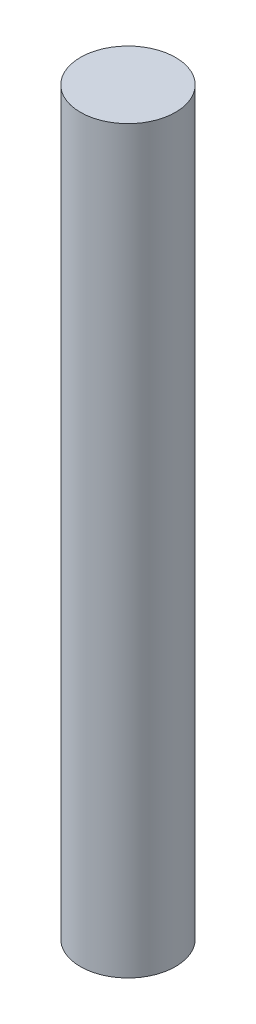
ISO-10303-21;
HEADER;
FILE_DESCRIPTION(('STEP AP214'),'2;1');
FILE_NAME('part.step','',(''),(''),'','','');
FILE_SCHEMA(('AUTOMOTIVE_DESIGN { 1 0 10303 214 1 1 1 1 }'));
ENDSEC;
DATA;
#1=APPLICATION_CONTEXT('core data for automotive mechanical design processes');
#2=APPLICATION_PROTOCOL_DEFINITION('international standard','automotive_design',2000,#1);
#3=PRODUCT_CONTEXT('',#1,'mechanical');
#4=PRODUCT('Part','Part','',(#3));
#5=PRODUCT_RELATED_PRODUCT_CATEGORY('part','',(#4));
#6=PRODUCT_DEFINITION_FORMATION('','',#4);
#7=PRODUCT_DEFINITION_CONTEXT('part definition',#1,'design');
#8=PRODUCT_DEFINITION('design','',#6,#7);
#9=PRODUCT_DEFINITION_SHAPE('','',#8);
#10=(LENGTH_UNIT() NAMED_UNIT(*) SI_UNIT(.MILLI.,.METRE.));
#11=(NAMED_UNIT(*) PLANE_ANGLE_UNIT() SI_UNIT($,.RADIAN.));
#12=(NAMED_UNIT(*) SI_UNIT($,.STERADIAN.) SOLID_ANGLE_UNIT());
#13=UNCERTAINTY_MEASURE_WITH_UNIT(LENGTH_MEASURE(1.E-05),#10,'distance_accuracy_value','');
#14=(GEOMETRIC_REPRESENTATION_CONTEXT(3) GLOBAL_UNCERTAINTY_ASSIGNED_CONTEXT((#13)) GLOBAL_UNIT_ASSIGNED_CONTEXT((#10,
#11,#12)) REPRESENTATION_CONTEXT('',''));
#15=CARTESIAN_POINT('',(0.,0.,0.));
#16=DIRECTION('',(0.,0.,1.));
#17=DIRECTION('',(1.,0.,0.));
#18=AXIS2_PLACEMENT_3D('',#15,#16,#17);
#19=CARTESIAN_POINT('',(0.,35.,0.));
#20=DIRECTION('',(0.,-1.,0.));
#21=DIRECTION('',(0.,0.,-1.));
#22=AXIS2_PLACEMENT_3D('',#19,#20,#21);
#23=CYLINDRICAL_SURFACE('',#22,2.25);
#24=CARTESIAN_POINT('',(0.,35.,0.));
#25=DIRECTION('',(0.,1.,0.));
#26=DIRECTION('',(0.,0.,1.));
#27=AXIS2_PLACEMENT_3D('',#24,#25,#26);
#28=CIRCLE('',#27,2.25);
#29=CARTESIAN_POINT('',(0.,35.,2.25));
#30=VERTEX_POINT('',#29);
#31=EDGE_CURVE('E10',#30,#30,#28,.T.);
#32=ORIENTED_EDGE('',*,*,#31,.F.);
#33=EDGE_LOOP('',(#32));
#34=FACE_BOUND('',#33,.T.);
#35=CARTESIAN_POINT('',(0.,0.,0.));
#36=DIRECTION('',(0.,1.,0.));
#37=DIRECTION('',(0.,0.,1.));
#38=AXIS2_PLACEMENT_3D('',#35,#36,#37);
#39=CIRCLE('',#38,2.25);
#40=CARTESIAN_POINT('',(0.,0.,2.25));
#41=VERTEX_POINT('',#40);
#42=EDGE_CURVE('E46',#41,#41,#39,.T.);
#43=ORIENTED_EDGE('',*,*,#42,.T.);
#44=EDGE_LOOP('',(#43));
#45=FACE_BOUND('',#44,.T.);
#46=ADVANCED_FACE('F43',(#34,#45),#23,.T.);
#47=CARTESIAN_POINT('',(0.,35.,0.));
#48=DIRECTION('',(0.,1.,0.));
#49=DIRECTION('',(0.,0.,1.));
#50=AXIS2_PLACEMENT_3D('',#47,#48,#49);
#51=PLANE('',#50);
#52=ORIENTED_EDGE('',*,*,#31,.T.);
#53=EDGE_LOOP('',(#52));
#54=FACE_BOUND('',#53,.T.);
#55=ADVANCED_FACE('F60',(#54),#51,.T.);
#56=CARTESIAN_POINT('',(0.,0.,0.));
#57=DIRECTION('',(0.,1.,0.));
#58=DIRECTION('',(0.,0.,1.));
#59=AXIS2_PLACEMENT_3D('',#56,#57,#58);
#60=PLANE('',#59);
#61=ORIENTED_EDGE('',*,*,#42,.F.);
#62=EDGE_LOOP('',(#61));
#63=FACE_BOUND('',#62,.T.);
#64=ADVANCED_FACE('F58',(#63),#60,.F.);
#65=CLOSED_SHELL('',(#46,#55,#64));
#66=MANIFOLD_SOLID_BREP('B2',#65);
#67=ADVANCED_BREP_SHAPE_REPRESENTATION('',(#18,#66),#14);
#68=SHAPE_DEFINITION_REPRESENTATION(#9,#67);
ENDSEC;
END-ISO-10303-21;
